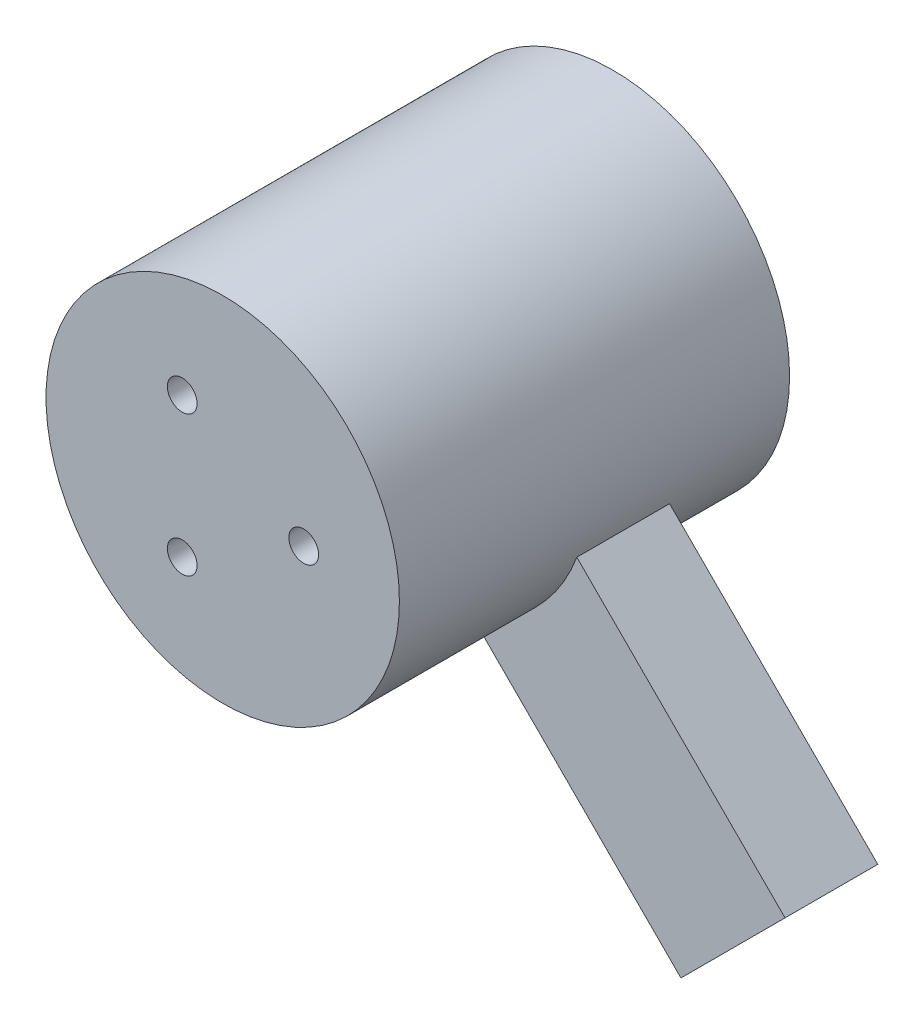
ISO-10303-21;
HEADER;
FILE_DESCRIPTION(('STEP AP214'),'2;1');
FILE_NAME('part.step','',(''),(''),'','','');
FILE_SCHEMA(('AUTOMOTIVE_DESIGN { 1 0 10303 214 1 1 1 1 }'));
ENDSEC;
DATA;
#1=APPLICATION_CONTEXT('core data for automotive mechanical design processes');
#2=APPLICATION_PROTOCOL_DEFINITION('international standard','automotive_design',2000,#1);
#3=PRODUCT_CONTEXT('',#1,'mechanical');
#4=PRODUCT('Part','Part','',(#3));
#5=PRODUCT_RELATED_PRODUCT_CATEGORY('part','',(#4));
#6=PRODUCT_DEFINITION_FORMATION('','',#4);
#7=PRODUCT_DEFINITION_CONTEXT('part definition',#1,'design');
#8=PRODUCT_DEFINITION('design','',#6,#7);
#9=PRODUCT_DEFINITION_SHAPE('','',#8);
#10=(LENGTH_UNIT() NAMED_UNIT(*) SI_UNIT(.MILLI.,.METRE.));
#11=(NAMED_UNIT(*) PLANE_ANGLE_UNIT() SI_UNIT($,.RADIAN.));
#12=(NAMED_UNIT(*) SI_UNIT($,.STERADIAN.) SOLID_ANGLE_UNIT());
#13=UNCERTAINTY_MEASURE_WITH_UNIT(LENGTH_MEASURE(1.E-05),#10,'distance_accuracy_value','');
#14=(GEOMETRIC_REPRESENTATION_CONTEXT(3) GLOBAL_UNCERTAINTY_ASSIGNED_CONTEXT((#13)) GLOBAL_UNIT_ASSIGNED_CONTEXT((#10,
#11,#12)) REPRESENTATION_CONTEXT('',''));
#15=CARTESIAN_POINT('',(0.,0.,0.));
#16=DIRECTION('',(0.,0.,1.));
#17=DIRECTION('',(1.,0.,0.));
#18=AXIS2_PLACEMENT_3D('',#15,#16,#17);
#19=CARTESIAN_POINT('',(0.,0.,28.));
#20=DIRECTION('',(0.,0.,-1.));
#21=DIRECTION('',(-1.,0.,0.));
#22=AXIS2_PLACEMENT_3D('',#19,#20,#21);
#23=CYLINDRICAL_SURFACE('',#22,12.);
#24=CARTESIAN_POINT('',(0.,0.,13.7));
#25=DIRECTION('',(0.,0.,-1.));
#26=DIRECTION('',(-1.,0.,0.));
#27=AXIS2_PLACEMENT_3D('',#24,#25,#26);
#28=CIRCLE('',#27,12.);
#29=CARTESIAN_POINT('',(11.2491582162035,-4.17809040433801,13.7));
#30=VERTEX_POINT('',#29);
#31=CARTESIAN_POINT('',(4.17809040433803,-11.2491582162035,13.7));
#32=VERTEX_POINT('',#31);
#33=EDGE_CURVE('E88',#30,#32,#28,.T.);
#34=ORIENTED_EDGE('',*,*,#33,.F.);
#35=DIRECTION('',(0.,0.,-1.));
#36=VECTOR('',#35,1.);
#37=CARTESIAN_POINT('',(11.2491582162035,-4.17809040433801,13.7));
#38=LINE('',#37,#36);
#39=CARTESIAN_POINT('',(11.2491582162035,-4.17809040433801,7.4));
#40=VERTEX_POINT('',#39);
#41=EDGE_CURVE('E99',#30,#40,#38,.T.);
#42=ORIENTED_EDGE('',*,*,#41,.T.);
#43=CARTESIAN_POINT('',(0.,0.,7.4));
#44=DIRECTION('',(0.,0.,-1.));
#45=DIRECTION('',(-1.,0.,0.));
#46=AXIS2_PLACEMENT_3D('',#43,#44,#45);
#47=CIRCLE('',#46,12.);
#48=CARTESIAN_POINT('',(4.17809040433803,-11.2491582162035,7.4));
#49=VERTEX_POINT('',#48);
#50=EDGE_CURVE('E121',#40,#49,#47,.T.);
#51=ORIENTED_EDGE('',*,*,#50,.T.);
#52=DIRECTION('',(0.,0.,-1.));
#53=VECTOR('',#52,1.);
#54=CARTESIAN_POINT('',(4.17809040433803,-11.2491582162035,13.7));
#55=LINE('',#54,#53);
#56=EDGE_CURVE('E106',#32,#49,#55,.T.);
#57=ORIENTED_EDGE('',*,*,#56,.F.);
#58=EDGE_LOOP('',(#34,#42,#51,#57));
#59=FACE_BOUND('',#58,.T.);
#60=CARTESIAN_POINT('',(0.,0.,0.));
#61=DIRECTION('',(0.,0.,1.));
#62=DIRECTION('',(1.,0.,0.));
#63=AXIS2_PLACEMENT_3D('',#60,#61,#62);
#64=CIRCLE('',#63,12.);
#65=CARTESIAN_POINT('',(12.,0.,0.));
#66=VERTEX_POINT('',#65);
#67=EDGE_CURVE('E11',#66,#66,#64,.T.);
#68=ORIENTED_EDGE('',*,*,#67,.T.);
#69=EDGE_LOOP('',(#68));
#70=FACE_BOUND('',#69,.T.);
#71=CARTESIAN_POINT('',(0.,0.,26.5));
#72=DIRECTION('',(0.,0.,1.));
#73=DIRECTION('',(1.,0.,0.));
#74=AXIS2_PLACEMENT_3D('',#71,#72,#73);
#75=CIRCLE('',#74,12.);
#76=CARTESIAN_POINT('',(12.,0.,26.5));
#77=VERTEX_POINT('',#76);
#78=EDGE_CURVE('E122',#77,#77,#75,.T.);
#79=ORIENTED_EDGE('',*,*,#78,.F.);
#80=EDGE_LOOP('',(#79));
#81=FACE_BOUND('',#80,.T.);
#82=ADVANCED_FACE('F43',(#59,#70,#81),#23,.T.);
#83=CARTESIAN_POINT('',(-8.,0.,28.));
#84=DIRECTION('',(0.,0.,-1.));
#85=DIRECTION('',(-1.,0.,0.));
#86=AXIS2_PLACEMENT_3D('',#83,#84,#85);
#87=CYLINDRICAL_SURFACE('',#86,1.5);
#88=CARTESIAN_POINT('',(-8.,0.,0.));
#89=DIRECTION('',(0.,0.,1.));
#90=DIRECTION('',(1.,0.,0.));
#91=AXIS2_PLACEMENT_3D('',#88,#89,#90);
#92=CIRCLE('',#91,1.5);
#93=CARTESIAN_POINT('',(-6.5,0.,0.));
#94=VERTEX_POINT('',#93);
#95=EDGE_CURVE('E52',#94,#94,#92,.T.);
#96=ORIENTED_EDGE('',*,*,#95,.F.);
#97=EDGE_LOOP('',(#96));
#98=FACE_BOUND('',#97,.T.);
#99=CARTESIAN_POINT('',(-8.,0.,17.));
#100=DIRECTION('',(0.,0.,1.));
#101=DIRECTION('',(1.,0.,0.));
#102=AXIS2_PLACEMENT_3D('',#99,#100,#101);
#103=CIRCLE('',#102,1.5);
#104=CARTESIAN_POINT('',(-6.5,0.,17.));
#105=VERTEX_POINT('',#104);
#106=EDGE_CURVE('E144',#105,#105,#103,.T.);
#107=ORIENTED_EDGE('',*,*,#106,.T.);
#108=EDGE_LOOP('',(#107));
#109=FACE_BOUND('',#108,.T.);
#110=ADVANCED_FACE('F167',(#98,#109),#87,.F.);
#111=CARTESIAN_POINT('',(8.,0.,28.));
#112=DIRECTION('',(0.,0.,-1.));
#113=DIRECTION('',(-1.,0.,0.));
#114=AXIS2_PLACEMENT_3D('',#111,#112,#113);
#115=CYLINDRICAL_SURFACE('',#114,1.5);
#116=CARTESIAN_POINT('',(8.,0.,0.));
#117=DIRECTION('',(0.,0.,1.));
#118=DIRECTION('',(-1.,0.,0.));
#119=AXIS2_PLACEMENT_3D('',#116,#117,#118);
#120=CIRCLE('',#119,1.5);
#121=CARTESIAN_POINT('',(6.5,0.,0.));
#122=VERTEX_POINT('',#121);
#123=EDGE_CURVE('E156',#122,#122,#120,.T.);
#124=ORIENTED_EDGE('',*,*,#123,.F.);
#125=EDGE_LOOP('',(#124));
#126=FACE_BOUND('',#125,.T.);
#127=CARTESIAN_POINT('',(8.,0.,17.));
#128=DIRECTION('',(0.,0.,1.));
#129=DIRECTION('',(1.,0.,0.));
#130=AXIS2_PLACEMENT_3D('',#127,#128,#129);
#131=CIRCLE('',#130,1.5);
#132=CARTESIAN_POINT('',(9.5,0.,17.));
#133=VERTEX_POINT('',#132);
#134=EDGE_CURVE('E140',#133,#133,#131,.T.);
#135=ORIENTED_EDGE('',*,*,#134,.T.);
#136=EDGE_LOOP('',(#135));
#137=FACE_BOUND('',#136,.T.);
#138=ADVANCED_FACE('F170',(#126,#137),#115,.F.);
#139=CARTESIAN_POINT('',(0.,8.,28.));
#140=DIRECTION('',(0.,0.,-1.));
#141=DIRECTION('',(-1.,0.,0.));
#142=AXIS2_PLACEMENT_3D('',#139,#140,#141);
#143=CYLINDRICAL_SURFACE('',#142,1.5);
#144=CARTESIAN_POINT('',(0.,8.,0.));
#145=DIRECTION('',(0.,0.,1.));
#146=DIRECTION('',(1.,0.,0.));
#147=AXIS2_PLACEMENT_3D('',#144,#145,#146);
#148=CIRCLE('',#147,1.5);
#149=CARTESIAN_POINT('',(1.5,8.,0.));
#150=VERTEX_POINT('',#149);
#151=EDGE_CURVE('E152',#150,#150,#148,.T.);
#152=ORIENTED_EDGE('',*,*,#151,.F.);
#153=EDGE_LOOP('',(#152));
#154=FACE_BOUND('',#153,.T.);
#155=CARTESIAN_POINT('',(0.,8.,17.));
#156=DIRECTION('',(0.,0.,1.));
#157=DIRECTION('',(1.,0.,0.));
#158=AXIS2_PLACEMENT_3D('',#155,#156,#157);
#159=CIRCLE('',#158,1.5);
#160=CARTESIAN_POINT('',(1.5,8.,17.));
#161=VERTEX_POINT('',#160);
#162=EDGE_CURVE('E136',#161,#161,#159,.T.);
#163=ORIENTED_EDGE('',*,*,#162,.T.);
#164=EDGE_LOOP('',(#163));
#165=FACE_BOUND('',#164,.T.);
#166=ADVANCED_FACE('F208',(#154,#165),#143,.F.);
#167=CARTESIAN_POINT('',(0.,-8.,28.));
#168=DIRECTION('',(0.,0.,-1.));
#169=DIRECTION('',(-1.,0.,0.));
#170=AXIS2_PLACEMENT_3D('',#167,#168,#169);
#171=CYLINDRICAL_SURFACE('',#170,1.5);
#172=CARTESIAN_POINT('',(0.,-8.,0.));
#173=DIRECTION('',(0.,0.,1.));
#174=DIRECTION('',(-1.,0.,0.));
#175=AXIS2_PLACEMENT_3D('',#172,#173,#174);
#176=CIRCLE('',#175,1.5);
#177=CARTESIAN_POINT('',(-1.5,-8.,0.));
#178=VERTEX_POINT('',#177);
#179=EDGE_CURVE('E148',#178,#178,#176,.T.);
#180=ORIENTED_EDGE('',*,*,#179,.F.);
#181=EDGE_LOOP('',(#180));
#182=FACE_BOUND('',#181,.T.);
#183=CARTESIAN_POINT('',(0.,-8.,17.));
#184=DIRECTION('',(0.,0.,1.));
#185=DIRECTION('',(1.,0.,0.));
#186=AXIS2_PLACEMENT_3D('',#183,#184,#185);
#187=CIRCLE('',#186,1.5);
#188=CARTESIAN_POINT('',(1.5,-8.,17.));
#189=VERTEX_POINT('',#188);
#190=EDGE_CURVE('E46',#189,#189,#187,.T.);
#191=ORIENTED_EDGE('',*,*,#190,.T.);
#192=EDGE_LOOP('',(#191));
#193=FACE_BOUND('',#192,.T.);
#194=ADVANCED_FACE('F216',(#182,#193),#171,.F.);
#195=CARTESIAN_POINT('',(0.,0.,0.));
#196=DIRECTION('',(0.,0.,1.));
#197=DIRECTION('',(1.,0.,0.));
#198=AXIS2_PLACEMENT_3D('',#195,#196,#197);
#199=PLANE('',#198);
#200=ORIENTED_EDGE('',*,*,#67,.F.);
#201=EDGE_LOOP('',(#200));
#202=FACE_BOUND('',#201,.T.);
#203=ORIENTED_EDGE('',*,*,#95,.T.);
#204=EDGE_LOOP('',(#203));
#205=FACE_BOUND('',#204,.T.);
#206=ORIENTED_EDGE('',*,*,#123,.T.);
#207=EDGE_LOOP('',(#206));
#208=FACE_BOUND('',#207,.T.);
#209=ORIENTED_EDGE('',*,*,#151,.T.);
#210=EDGE_LOOP('',(#209));
#211=FACE_BOUND('',#210,.T.);
#212=ORIENTED_EDGE('',*,*,#179,.T.);
#213=EDGE_LOOP('',(#212));
#214=FACE_BOUND('',#213,.T.);
#215=ADVANCED_FACE('F164',(#202,#205,#208,#211,#214),#199,.F.);
#216=CARTESIAN_POINT('',(0.,0.,17.));
#217=DIRECTION('',(0.,0.,1.));
#218=DIRECTION('',(1.,0.,0.));
#219=AXIS2_PLACEMENT_3D('',#216,#217,#218);
#220=PLANE('',#219);
#221=ORIENTED_EDGE('',*,*,#190,.F.);
#222=EDGE_LOOP('',(#221));
#223=FACE_BOUND('',#222,.T.);
#224=ADVANCED_FACE('F179',(#223),#220,.F.);
#225=ORIENTED_EDGE('',*,*,#162,.F.);
#226=EDGE_LOOP('',(#225));
#227=FACE_BOUND('',#226,.T.);
#228=ADVANCED_FACE('F187',(#227),#220,.F.);
#229=ORIENTED_EDGE('',*,*,#134,.F.);
#230=EDGE_LOOP('',(#229));
#231=FACE_BOUND('',#230,.T.);
#232=ADVANCED_FACE('F177',(#231),#220,.F.);
#233=ORIENTED_EDGE('',*,*,#106,.F.);
#234=EDGE_LOOP('',(#233));
#235=FACE_BOUND('',#234,.T.);
#236=ADVANCED_FACE('F174',(#235),#220,.F.);
#237=CARTESIAN_POINT('',(-3.53553390593273,-3.53553390593274,13.7));
#238=DIRECTION('',(0.707106781186547,0.707106781186548,0.));
#239=DIRECTION('',(-0.707106781186548,0.707106781186547,0.));
#240=AXIS2_PLACEMENT_3D('',#237,#238,#239);
#241=PLANE('',#240);
#242=DIRECTION('',(0.707106781186548,-0.707106781186547,0.));
#243=VECTOR('',#242,1.);
#244=CARTESIAN_POINT('',(-3.53553390593273,-3.53553390593274,7.4));
#245=LINE('',#244,#243);
#246=CARTESIAN_POINT('',(18.320226028069,-25.3912938399344,7.4));
#247=VERTEX_POINT('',#246);
#248=EDGE_CURVE('E59',#49,#247,#245,.T.);
#249=ORIENTED_EDGE('',*,*,#248,.T.);
#250=DIRECTION('',(0.,0.,-1.));
#251=VECTOR('',#250,1.);
#252=CARTESIAN_POINT('',(18.320226028069,-25.3912938399344,13.7));
#253=LINE('',#252,#251);
#254=CARTESIAN_POINT('',(18.320226028069,-25.3912938399344,13.7));
#255=VERTEX_POINT('',#254);
#256=EDGE_CURVE('E129',#255,#247,#253,.T.);
#257=ORIENTED_EDGE('',*,*,#256,.F.);
#258=DIRECTION('',(0.707106781186548,-0.707106781186547,0.));
#259=VECTOR('',#258,1.);
#260=CARTESIAN_POINT('',(-3.53553390593273,-3.53553390593274,13.7));
#261=LINE('',#260,#259);
#262=EDGE_CURVE('E111',#32,#255,#261,.T.);
#263=ORIENTED_EDGE('',*,*,#262,.F.);
#264=ORIENTED_EDGE('',*,*,#56,.T.);
#265=EDGE_LOOP('',(#249,#257,#263,#264));
#266=FACE_BOUND('',#265,.T.);
#267=ADVANCED_FACE('F176',(#266),#241,.F.);
#268=CARTESIAN_POINT('',(21.8557599340017,-21.8557599340017,13.7));
#269=DIRECTION('',(-0.707106781186548,0.707106781186547,0.));
#270=DIRECTION('',(-0.707106781186547,-0.707106781186548,0.));
#271=AXIS2_PLACEMENT_3D('',#268,#269,#270);
#272=PLANE('',#271);
#273=DIRECTION('',(0.707106781186547,0.707106781186548,0.));
#274=VECTOR('',#273,1.);
#275=CARTESIAN_POINT('',(21.8557599340017,-21.8557599340017,7.4));
#276=LINE('',#275,#274);
#277=CARTESIAN_POINT('',(25.3912938399345,-18.3202260280689,7.4));
#278=VERTEX_POINT('',#277);
#279=EDGE_CURVE('E82',#247,#278,#276,.T.);
#280=ORIENTED_EDGE('',*,*,#279,.T.);
#281=DIRECTION('',(0.,0.,-1.));
#282=VECTOR('',#281,1.);
#283=CARTESIAN_POINT('',(25.3912938399345,-18.3202260280689,13.7));
#284=LINE('',#283,#282);
#285=CARTESIAN_POINT('',(25.3912938399345,-18.3202260280689,13.7));
#286=VERTEX_POINT('',#285);
#287=EDGE_CURVE('E105',#286,#278,#284,.T.);
#288=ORIENTED_EDGE('',*,*,#287,.F.);
#289=DIRECTION('',(0.707106781186547,0.707106781186548,0.));
#290=VECTOR('',#289,1.);
#291=CARTESIAN_POINT('',(21.8557599340017,-21.8557599340017,13.7));
#292=LINE('',#291,#290);
#293=EDGE_CURVE('E68',#255,#286,#292,.T.);
#294=ORIENTED_EDGE('',*,*,#293,.F.);
#295=ORIENTED_EDGE('',*,*,#256,.T.);
#296=EDGE_LOOP('',(#280,#288,#294,#295));
#297=FACE_BOUND('',#296,.T.);
#298=ADVANCED_FACE('F184',(#297),#272,.F.);
#299=CARTESIAN_POINT('',(3.53553390593273,3.53553390593274,13.7));
#300=DIRECTION('',(-0.707106781186547,-0.707106781186548,0.));
#301=DIRECTION('',(0.707106781186548,-0.707106781186547,0.));
#302=AXIS2_PLACEMENT_3D('',#299,#300,#301);
#303=PLANE('',#302);
#304=DIRECTION('',(-0.707106781186548,0.707106781186547,0.));
#305=VECTOR('',#304,1.);
#306=CARTESIAN_POINT('',(3.53553390593273,3.53553390593274,7.4));
#307=LINE('',#306,#305);
#308=EDGE_CURVE('E101',#278,#40,#307,.T.);
#309=ORIENTED_EDGE('',*,*,#308,.T.);
#310=ORIENTED_EDGE('',*,*,#41,.F.);
#311=DIRECTION('',(-0.707106781186548,0.707106781186547,0.));
#312=VECTOR('',#311,1.);
#313=CARTESIAN_POINT('',(3.53553390593273,3.53553390593274,13.7));
#314=LINE('',#313,#312);
#315=EDGE_CURVE('E91',#286,#30,#314,.T.);
#316=ORIENTED_EDGE('',*,*,#315,.F.);
#317=ORIENTED_EDGE('',*,*,#287,.T.);
#318=EDGE_LOOP('',(#309,#310,#316,#317));
#319=FACE_BOUND('',#318,.T.);
#320=ADVANCED_FACE('F100',(#319),#303,.F.);
#321=CARTESIAN_POINT('',(0.,0.,13.7));
#322=DIRECTION('',(0.,0.,-1.));
#323=DIRECTION('',(-1.,0.,0.));
#324=AXIS2_PLACEMENT_3D('',#321,#322,#323);
#325=PLANE('',#324);
#326=ORIENTED_EDGE('',*,*,#262,.T.);
#327=ORIENTED_EDGE('',*,*,#293,.T.);
#328=ORIENTED_EDGE('',*,*,#315,.T.);
#329=ORIENTED_EDGE('',*,*,#33,.T.);
#330=EDGE_LOOP('',(#326,#327,#328,#329));
#331=FACE_BOUND('',#330,.T.);
#332=ADVANCED_FACE('F93',(#331),#325,.F.);
#333=CARTESIAN_POINT('',(0.,0.,7.4));
#334=DIRECTION('',(0.,0.,-1.));
#335=DIRECTION('',(-1.,0.,0.));
#336=AXIS2_PLACEMENT_3D('',#333,#334,#335);
#337=PLANE('',#336);
#338=ORIENTED_EDGE('',*,*,#248,.F.);
#339=ORIENTED_EDGE('',*,*,#50,.F.);
#340=ORIENTED_EDGE('',*,*,#308,.F.);
#341=ORIENTED_EDGE('',*,*,#279,.F.);
#342=EDGE_LOOP('',(#338,#339,#340,#341));
#343=FACE_BOUND('',#342,.T.);
#344=ADVANCED_FACE('F277',(#343),#337,.T.);
#345=CARTESIAN_POINT('',(0.,0.,26.5));
#346=DIRECTION('',(0.,0.,1.));
#347=DIRECTION('',(1.,0.,0.));
#348=AXIS2_PLACEMENT_3D('',#345,#346,#347);
#349=PLANE('',#348);
#350=CARTESIAN_POINT('',(5.5,0.,26.5));
#351=DIRECTION('',(0.,0.,1.));
#352=DIRECTION('',(1.,0.,0.));
#353=AXIS2_PLACEMENT_3D('',#350,#351,#352);
#354=CIRCLE('',#353,1.01);
#355=CARTESIAN_POINT('',(6.51,0.,26.5));
#356=VERTEX_POINT('',#355);
#357=EDGE_CURVE('E367',#356,#356,#354,.T.);
#358=ORIENTED_EDGE('',*,*,#357,.F.);
#359=EDGE_LOOP('',(#358));
#360=FACE_BOUND('',#359,.T.);
#361=CARTESIAN_POINT('',(-2.75,-4.76313972081441,26.5));
#362=DIRECTION('',(0.,0.,1.));
#363=DIRECTION('',(1.,0.,0.));
#364=AXIS2_PLACEMENT_3D('',#361,#362,#363);
#365=CIRCLE('',#364,1.01);
#366=CARTESIAN_POINT('',(-1.74,-4.76313972081441,26.5));
#367=VERTEX_POINT('',#366);
#368=EDGE_CURVE('E379',#367,#367,#365,.T.);
#369=ORIENTED_EDGE('',*,*,#368,.F.);
#370=EDGE_LOOP('',(#369));
#371=FACE_BOUND('',#370,.T.);
#372=CARTESIAN_POINT('',(-2.75,4.76313972081441,26.5));
#373=DIRECTION('',(0.,0.,1.));
#374=DIRECTION('',(1.,0.,0.));
#375=AXIS2_PLACEMENT_3D('',#372,#373,#374);
#376=CIRCLE('',#375,1.01);
#377=CARTESIAN_POINT('',(-1.74,4.76313972081441,26.5));
#378=VERTEX_POINT('',#377);
#379=EDGE_CURVE('E387',#378,#378,#376,.T.);
#380=ORIENTED_EDGE('',*,*,#379,.F.);
#381=EDGE_LOOP('',(#380));
#382=FACE_BOUND('',#381,.T.);
#383=ORIENTED_EDGE('',*,*,#78,.T.);
#384=EDGE_LOOP('',(#383));
#385=FACE_BOUND('',#384,.T.);
#386=ADVANCED_FACE('F285',(#360,#371,#382,#385),#349,.T.);
#387=CARTESIAN_POINT('',(-2.75,4.76313972081441,25.));
#388=DIRECTION('',(0.,0.,1.));
#389=DIRECTION('',(1.,0.,0.));
#390=AXIS2_PLACEMENT_3D('',#387,#388,#389);
#391=CYLINDRICAL_SURFACE('',#390,1.01);
#392=CARTESIAN_POINT('',(-2.75,4.76313972081441,25.));
#393=DIRECTION('',(0.,0.,1.));
#394=DIRECTION('',(1.,0.,0.));
#395=AXIS2_PLACEMENT_3D('',#392,#393,#394);
#396=CIRCLE('',#395,1.01);
#397=CARTESIAN_POINT('',(-1.74,4.76313972081441,25.));
#398=VERTEX_POINT('',#397);
#399=EDGE_CURVE('E383',#398,#398,#396,.T.);
#400=ORIENTED_EDGE('',*,*,#399,.F.);
#401=EDGE_LOOP('',(#400));
#402=FACE_BOUND('',#401,.T.);
#403=ORIENTED_EDGE('',*,*,#379,.T.);
#404=EDGE_LOOP('',(#403));
#405=FACE_BOUND('',#404,.T.);
#406=ADVANCED_FACE('F294',(#402,#405),#391,.F.);
#407=CARTESIAN_POINT('',(-2.75,4.76313972081441,25.));
#408=DIRECTION('',(0.,0.,1.));
#409=DIRECTION('',(1.,0.,0.));
#410=AXIS2_PLACEMENT_3D('',#407,#408,#409);
#411=PLANE('',#410);
#412=ORIENTED_EDGE('',*,*,#399,.T.);
#413=EDGE_LOOP('',(#412));
#414=FACE_BOUND('',#413,.T.);
#415=ADVANCED_FACE('F302',(#414),#411,.T.);
#416=CARTESIAN_POINT('',(-2.75,-4.76313972081441,25.));
#417=DIRECTION('',(0.,0.,1.));
#418=DIRECTION('',(1.,0.,0.));
#419=AXIS2_PLACEMENT_3D('',#416,#417,#418);
#420=CYLINDRICAL_SURFACE('',#419,1.01);
#421=CARTESIAN_POINT('',(-2.75,-4.76313972081441,25.));
#422=DIRECTION('',(0.,0.,1.));
#423=DIRECTION('',(1.,0.,0.));
#424=AXIS2_PLACEMENT_3D('',#421,#422,#423);
#425=CIRCLE('',#424,1.01);
#426=CARTESIAN_POINT('',(-1.74,-4.76313972081441,25.));
#427=VERTEX_POINT('',#426);
#428=EDGE_CURVE('E373',#427,#427,#425,.T.);
#429=ORIENTED_EDGE('',*,*,#428,.F.);
#430=EDGE_LOOP('',(#429));
#431=FACE_BOUND('',#430,.T.);
#432=ORIENTED_EDGE('',*,*,#368,.T.);
#433=EDGE_LOOP('',(#432));
#434=FACE_BOUND('',#433,.T.);
#435=ADVANCED_FACE('F310',(#431,#434),#420,.F.);
#436=CARTESIAN_POINT('',(-2.75,-4.76313972081441,25.));
#437=DIRECTION('',(0.,0.,1.));
#438=DIRECTION('',(1.,0.,0.));
#439=AXIS2_PLACEMENT_3D('',#436,#437,#438);
#440=PLANE('',#439);
#441=ORIENTED_EDGE('',*,*,#428,.T.);
#442=EDGE_LOOP('',(#441));
#443=FACE_BOUND('',#442,.T.);
#444=ADVANCED_FACE('F318',(#443),#440,.T.);
#445=CARTESIAN_POINT('',(5.5,0.,25.));
#446=DIRECTION('',(0.,0.,1.));
#447=DIRECTION('',(1.,0.,0.));
#448=AXIS2_PLACEMENT_3D('',#445,#446,#447);
#449=CYLINDRICAL_SURFACE('',#448,1.01);
#450=CARTESIAN_POINT('',(5.5,0.,25.));
#451=DIRECTION('',(0.,0.,1.));
#452=DIRECTION('',(1.,0.,0.));
#453=AXIS2_PLACEMENT_3D('',#450,#451,#452);
#454=CIRCLE('',#453,1.01);
#455=CARTESIAN_POINT('',(6.51,0.,25.));
#456=VERTEX_POINT('',#455);
#457=EDGE_CURVE('E365',#456,#456,#454,.T.);
#458=ORIENTED_EDGE('',*,*,#457,.F.);
#459=EDGE_LOOP('',(#458));
#460=FACE_BOUND('',#459,.T.);
#461=ORIENTED_EDGE('',*,*,#357,.T.);
#462=EDGE_LOOP('',(#461));
#463=FACE_BOUND('',#462,.T.);
#464=ADVANCED_FACE('F326',(#460,#463),#449,.F.);
#465=CARTESIAN_POINT('',(5.5,0.,25.));
#466=DIRECTION('',(0.,0.,1.));
#467=DIRECTION('',(1.,0.,0.));
#468=AXIS2_PLACEMENT_3D('',#465,#466,#467);
#469=PLANE('',#468);
#470=ORIENTED_EDGE('',*,*,#457,.T.);
#471=EDGE_LOOP('',(#470));
#472=FACE_BOUND('',#471,.T.);
#473=ADVANCED_FACE('F334',(#472),#469,.T.);
#474=CLOSED_SHELL('',(#82,#110,#138,#166,#194,#215,#224,#228,#232,#236,#267,#298,#320,#332,#344,
#386,#406,#415,#435,#444,#464,#473));
#475=MANIFOLD_SOLID_BREP('B2',#474);
#476=ADVANCED_BREP_SHAPE_REPRESENTATION('',(#18,#475),#14);
#477=SHAPE_DEFINITION_REPRESENTATION(#9,#476);
ENDSEC;
END-ISO-10303-21;
